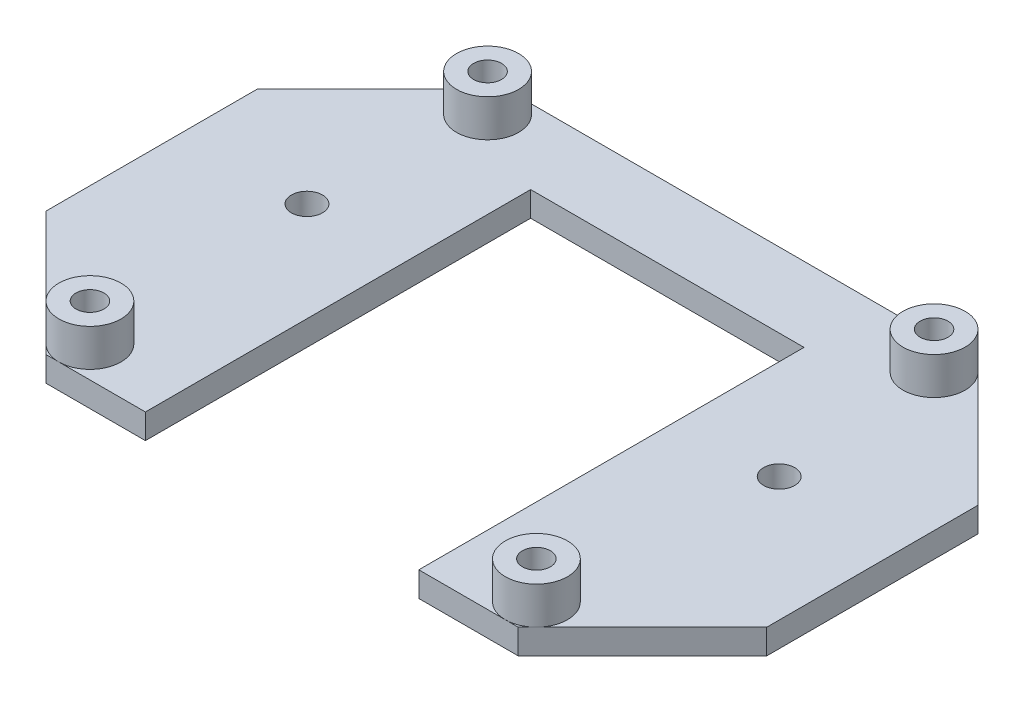
ISO-10303-21;
HEADER;
FILE_DESCRIPTION(('STEP AP214'),'2;1');
FILE_NAME('part.step','',(''),(''),'','','');
FILE_SCHEMA(('AUTOMOTIVE_DESIGN { 1 0 10303 214 1 1 1 1 }'));
ENDSEC;
DATA;
#1=APPLICATION_CONTEXT('core data for automotive mechanical design processes');
#2=APPLICATION_PROTOCOL_DEFINITION('international standard','automotive_design',2000,#1);
#3=PRODUCT_CONTEXT('',#1,'mechanical');
#4=PRODUCT('Part','Part','',(#3));
#5=PRODUCT_RELATED_PRODUCT_CATEGORY('part','',(#4));
#6=PRODUCT_DEFINITION_FORMATION('','',#4);
#7=PRODUCT_DEFINITION_CONTEXT('part definition',#1,'design');
#8=PRODUCT_DEFINITION('design','',#6,#7);
#9=PRODUCT_DEFINITION_SHAPE('','',#8);
#10=(LENGTH_UNIT() NAMED_UNIT(*) SI_UNIT(.MILLI.,.METRE.));
#11=(NAMED_UNIT(*) PLANE_ANGLE_UNIT() SI_UNIT($,.RADIAN.));
#12=(NAMED_UNIT(*) SI_UNIT($,.STERADIAN.) SOLID_ANGLE_UNIT());
#13=UNCERTAINTY_MEASURE_WITH_UNIT(LENGTH_MEASURE(1.E-05),#10,'distance_accuracy_value','');
#14=(GEOMETRIC_REPRESENTATION_CONTEXT(3) GLOBAL_UNCERTAINTY_ASSIGNED_CONTEXT((#13)) GLOBAL_UNIT_ASSIGNED_CONTEXT((#10,
#11,#12)) REPRESENTATION_CONTEXT('',''));
#15=CARTESIAN_POINT('',(0.,0.,0.));
#16=DIRECTION('',(0.,0.,1.));
#17=DIRECTION('',(1.,0.,0.));
#18=AXIS2_PLACEMENT_3D('',#15,#16,#17);
#19=CARTESIAN_POINT('',(0.,4.,0.));
#20=DIRECTION('',(0.,-1.,0.));
#21=DIRECTION('',(0.,0.,-1.));
#22=AXIS2_PLACEMENT_3D('',#19,#20,#21);
#23=PLANE('',#22);
#24=CARTESIAN_POINT('',(-35.9289321881345,4.,39.));
#25=DIRECTION('',(0.,1.,0.));
#26=DIRECTION('',(0.,0.,1.));
#27=AXIS2_PLACEMENT_3D('',#24,#25,#26);
#28=CIRCLE('',#27,5.);
#29=CARTESIAN_POINT('',(-39.4644660940672,4.,42.5355339059327));
#30=VERTEX_POINT('',#29);
#31=CARTESIAN_POINT('',(-35.9289321881345,4.,44.));
#32=VERTEX_POINT('',#31);
#33=EDGE_CURVE('E172',#30,#32,#28,.T.);
#34=ORIENTED_EDGE('',*,*,#33,.F.);
#35=DIRECTION('',(0.707106781186548,0.,0.707106781186547));
#36=VECTOR('',#35,1.);
#37=CARTESIAN_POINT('',(-38.,4.,44.));
#38=LINE('',#37,#36);
#39=CARTESIAN_POINT('',(-38.,4.,44.));
#40=VERTEX_POINT('',#39);
#41=EDGE_CURVE('E161',#30,#40,#38,.T.);
#42=ORIENTED_EDGE('',*,*,#41,.T.);
#43=DIRECTION('',(-1.,0.,0.));
#44=VECTOR('',#43,1.);
#45=CARTESIAN_POINT('',(-22.,4.,44.));
#46=LINE('',#45,#44);
#47=EDGE_CURVE('E173',#32,#40,#46,.T.);
#48=ORIENTED_EDGE('',*,*,#47,.F.);
#49=EDGE_LOOP('',(#34,#42,#48));
#50=FACE_BOUND('',#49,.T.);
#51=ADVANCED_FACE('F36',(#50),#23,.F.);
#52=CARTESIAN_POINT('',(35.9289321881345,4.,39.));
#53=DIRECTION('',(0.,1.,0.));
#54=DIRECTION('',(0.,0.,1.));
#55=AXIS2_PLACEMENT_3D('',#52,#53,#54);
#56=CIRCLE('',#55,5.);
#57=CARTESIAN_POINT('',(35.9289321881345,4.,44.));
#58=VERTEX_POINT('',#57);
#59=CARTESIAN_POINT('',(39.4644660940673,4.,42.5355339059328));
#60=VERTEX_POINT('',#59);
#61=EDGE_CURVE('E188',#58,#60,#56,.T.);
#62=ORIENTED_EDGE('',*,*,#61,.F.);
#63=DIRECTION('',(-1.,0.,0.));
#64=VECTOR('',#63,1.);
#65=CARTESIAN_POINT('',(58.,4.,44.));
#66=LINE('',#65,#64);
#67=CARTESIAN_POINT('',(38.,4.,44.));
#68=VERTEX_POINT('',#67);
#69=EDGE_CURVE('E209',#68,#58,#66,.T.);
#70=ORIENTED_EDGE('',*,*,#69,.F.);
#71=DIRECTION('',(0.707106781186547,0.,-0.707106781186548));
#72=VECTOR('',#71,1.);
#73=CARTESIAN_POINT('',(38.,4.,44.));
#74=LINE('',#73,#72);
#75=EDGE_CURVE('E170',#68,#60,#74,.T.);
#76=ORIENTED_EDGE('',*,*,#75,.T.);
#77=EDGE_LOOP('',(#62,#70,#76));
#78=FACE_BOUND('',#77,.T.);
#79=ADVANCED_FACE('F351',(#78),#23,.F.);
#80=EDGE_CURVE('E54',#32,#30,#28,.T.);
#81=ORIENTED_EDGE('',*,*,#80,.F.);
#82=CARTESIAN_POINT('',(-22.,4.,44.));
#83=VERTEX_POINT('',#82);
#84=EDGE_CURVE('E222',#83,#32,#46,.T.);
#85=ORIENTED_EDGE('',*,*,#84,.F.);
#86=DIRECTION('',(0.,0.,1.));
#87=VECTOR('',#86,1.);
#88=CARTESIAN_POINT('',(-22.,4.,24.));
#89=LINE('',#88,#87);
#90=CARTESIAN_POINT('',(-22.,4.,-18.));
#91=VERTEX_POINT('',#90);
#92=EDGE_CURVE('E224',#91,#83,#89,.T.);
#93=ORIENTED_EDGE('',*,*,#92,.F.);
#94=DIRECTION('',(-1.,0.,0.));
#95=VECTOR('',#94,1.);
#96=CARTESIAN_POINT('',(-22.,4.,-18.));
#97=LINE('',#96,#95);
#98=CARTESIAN_POINT('',(22.,4.,-18.));
#99=VERTEX_POINT('',#98);
#100=EDGE_CURVE('E225',#99,#91,#97,.T.);
#101=ORIENTED_EDGE('',*,*,#100,.F.);
#102=DIRECTION('',(0.,0.,-1.));
#103=VECTOR('',#102,1.);
#104=CARTESIAN_POINT('',(22.,4.,24.));
#105=LINE('',#104,#103);
#106=CARTESIAN_POINT('',(22.,4.,44.));
#107=VERTEX_POINT('',#106);
#108=EDGE_CURVE('E229',#107,#99,#105,.T.);
#109=ORIENTED_EDGE('',*,*,#108,.F.);
#110=EDGE_CURVE('E207',#58,#107,#66,.T.);
#111=ORIENTED_EDGE('',*,*,#110,.F.);
#112=EDGE_CURVE('E61',#60,#58,#56,.T.);
#113=ORIENTED_EDGE('',*,*,#112,.F.);
#114=CARTESIAN_POINT('',(58.,4.,24.));
#115=VERTEX_POINT('',#114);
#116=EDGE_CURVE('E288',#60,#115,#74,.T.);
#117=ORIENTED_EDGE('',*,*,#116,.T.);
#118=DIRECTION('',(0.,0.,-1.));
#119=VECTOR('',#118,1.);
#120=CARTESIAN_POINT('',(58.,4.,24.));
#121=LINE('',#120,#119);
#122=CARTESIAN_POINT('',(58.,4.,-9.99999999999994));
#123=VERTEX_POINT('',#122);
#124=EDGE_CURVE('E258',#115,#123,#121,.T.);
#125=ORIENTED_EDGE('',*,*,#124,.T.);
#126=DIRECTION('',(-0.707106781186546,0.,-0.707106781186549));
#127=VECTOR('',#126,1.);
#128=CARTESIAN_POINT('',(38.,4.,-30.));
#129=LINE('',#128,#127);
#130=CARTESIAN_POINT('',(39.4644660940672,4.,-28.5355339059328));
#131=VERTEX_POINT('',#130);
#132=EDGE_CURVE('E285',#123,#131,#129,.T.);
#133=ORIENTED_EDGE('',*,*,#132,.T.);
#134=CARTESIAN_POINT('',(35.9289321881345,4.,-25.));
#135=DIRECTION('',(0.,1.,0.));
#136=DIRECTION('',(0.,0.,1.));
#137=AXIS2_PLACEMENT_3D('',#134,#135,#136);
#138=CIRCLE('',#137,5.);
#139=CARTESIAN_POINT('',(35.9289321881345,4.,-30.));
#140=VERTEX_POINT('',#139);
#141=EDGE_CURVE('E187',#140,#131,#138,.T.);
#142=ORIENTED_EDGE('',*,*,#141,.F.);
#143=DIRECTION('',(1.,0.,0.));
#144=VECTOR('',#143,1.);
#145=CARTESIAN_POINT('',(-58.,4.,-30.));
#146=LINE('',#145,#144);
#147=CARTESIAN_POINT('',(-35.9289321881345,4.,-30.));
#148=VERTEX_POINT('',#147);
#149=EDGE_CURVE('E208',#148,#140,#146,.T.);
#150=ORIENTED_EDGE('',*,*,#149,.F.);
#151=CARTESIAN_POINT('',(-35.9289321881345,4.,-25.));
#152=DIRECTION('',(0.,1.,0.));
#153=DIRECTION('',(0.,0.,1.));
#154=AXIS2_PLACEMENT_3D('',#151,#152,#153);
#155=CIRCLE('',#154,5.);
#156=CARTESIAN_POINT('',(-39.4644660940673,4.,-28.5355339059327));
#157=VERTEX_POINT('',#156);
#158=EDGE_CURVE('E11',#157,#148,#155,.T.);
#159=ORIENTED_EDGE('',*,*,#158,.F.);
#160=DIRECTION('',(-0.707106781186547,0.,0.707106781186548));
#161=VECTOR('',#160,1.);
#162=CARTESIAN_POINT('',(-38.,4.,-30.));
#163=LINE('',#162,#161);
#164=CARTESIAN_POINT('',(-58.,4.,-9.99999999999993));
#165=VERTEX_POINT('',#164);
#166=EDGE_CURVE('E280',#157,#165,#163,.T.);
#167=ORIENTED_EDGE('',*,*,#166,.T.);
#168=DIRECTION('',(0.,0.,1.));
#169=VECTOR('',#168,1.);
#170=CARTESIAN_POINT('',(-58.,4.,24.));
#171=LINE('',#170,#169);
#172=CARTESIAN_POINT('',(-58.,4.,24.));
#173=VERTEX_POINT('',#172);
#174=EDGE_CURVE('E157',#165,#173,#171,.T.);
#175=ORIENTED_EDGE('',*,*,#174,.T.);
#176=EDGE_CURVE('E152',#173,#30,#38,.T.);
#177=ORIENTED_EDGE('',*,*,#176,.T.);
#178=EDGE_LOOP('',(#81,#85,#93,#101,#109,#111,#113,#117,#125,#133,#142,#150,#159,#167,#175,#177));
#179=FACE_BOUND('',#178,.T.);
#180=CARTESIAN_POINT('',(-38.,4.,2.00000000000001));
#181=DIRECTION('',(0.,1.,0.));
#182=DIRECTION('',(0.,0.,1.));
#183=AXIS2_PLACEMENT_3D('',#180,#181,#182);
#184=CIRCLE('',#183,2.5);
#185=CARTESIAN_POINT('',(-38.,4.,4.50000000000001));
#186=VERTEX_POINT('',#185);
#187=EDGE_CURVE('E246',#186,#186,#184,.T.);
#188=ORIENTED_EDGE('',*,*,#187,.F.);
#189=EDGE_LOOP('',(#188));
#190=FACE_BOUND('',#189,.T.);
#191=CARTESIAN_POINT('',(38.,4.,2.00000000000001));
#192=DIRECTION('',(0.,1.,0.));
#193=DIRECTION('',(0.,0.,1.));
#194=AXIS2_PLACEMENT_3D('',#191,#192,#193);
#195=CIRCLE('',#194,2.5);
#196=CARTESIAN_POINT('',(38.,4.,4.50000000000001));
#197=VERTEX_POINT('',#196);
#198=EDGE_CURVE('E236',#197,#197,#195,.T.);
#199=ORIENTED_EDGE('',*,*,#198,.F.);
#200=EDGE_LOOP('',(#199));
#201=FACE_BOUND('',#200,.T.);
#202=ADVANCED_FACE('F154',(#179,#190,#201),#23,.F.);
#203=EDGE_CURVE('E47',#148,#157,#155,.T.);
#204=ORIENTED_EDGE('',*,*,#203,.F.);
#205=CARTESIAN_POINT('',(-38.,4.,-30.));
#206=VERTEX_POINT('',#205);
#207=EDGE_CURVE('E205',#206,#148,#146,.T.);
#208=ORIENTED_EDGE('',*,*,#207,.F.);
#209=EDGE_CURVE('E281',#206,#157,#163,.T.);
#210=ORIENTED_EDGE('',*,*,#209,.T.);
#211=EDGE_LOOP('',(#204,#208,#210));
#212=FACE_BOUND('',#211,.T.);
#213=ADVANCED_FACE('F321',(#212),#23,.F.);
#214=CARTESIAN_POINT('',(58.,4.,24.));
#215=DIRECTION('',(-1.,0.,0.));
#216=DIRECTION('',(0.,0.,1.));
#217=AXIS2_PLACEMENT_3D('',#214,#215,#216);
#218=PLANE('',#217);
#219=ORIENTED_EDGE('',*,*,#124,.F.);
#220=DIRECTION('',(0.,-1.,0.));
#221=VECTOR('',#220,1.);
#222=CARTESIAN_POINT('',(58.,0.,24.));
#223=LINE('',#222,#221);
#224=CARTESIAN_POINT('',(58.,0.,24.));
#225=VERTEX_POINT('',#224);
#226=EDGE_CURVE('E295',#115,#225,#223,.T.);
#227=ORIENTED_EDGE('',*,*,#226,.T.);
#228=DIRECTION('',(0.,0.,-1.));
#229=VECTOR('',#228,1.);
#230=CARTESIAN_POINT('',(58.,0.,24.));
#231=LINE('',#230,#229);
#232=CARTESIAN_POINT('',(58.,0.,-9.99999999999994));
#233=VERTEX_POINT('',#232);
#234=EDGE_CURVE('E253',#225,#233,#231,.T.);
#235=ORIENTED_EDGE('',*,*,#234,.T.);
#236=DIRECTION('',(0.,1.,0.));
#237=VECTOR('',#236,1.);
#238=CARTESIAN_POINT('',(58.,4.,-9.99999999999994));
#239=LINE('',#238,#237);
#240=EDGE_CURVE('E293',#233,#123,#239,.T.);
#241=ORIENTED_EDGE('',*,*,#240,.T.);
#242=EDGE_LOOP('',(#219,#227,#235,#241));
#243=FACE_BOUND('',#242,.T.);
#244=ADVANCED_FACE('F367',(#243),#218,.F.);
#245=CARTESIAN_POINT('',(-58.,4.,24.));
#246=DIRECTION('',(1.,0.,0.));
#247=DIRECTION('',(0.,0.,-1.));
#248=AXIS2_PLACEMENT_3D('',#245,#246,#247);
#249=PLANE('',#248);
#250=DIRECTION('',(0.,0.,1.));
#251=VECTOR('',#250,1.);
#252=CARTESIAN_POINT('',(-58.,0.,24.));
#253=LINE('',#252,#251);
#254=CARTESIAN_POINT('',(-58.,0.,-9.99999999999993));
#255=VERTEX_POINT('',#254);
#256=CARTESIAN_POINT('',(-58.,0.,24.));
#257=VERTEX_POINT('',#256);
#258=EDGE_CURVE('E261',#255,#257,#253,.T.);
#259=ORIENTED_EDGE('',*,*,#258,.T.);
#260=DIRECTION('',(0.,1.,0.));
#261=VECTOR('',#260,1.);
#262=CARTESIAN_POINT('',(-58.,4.,24.));
#263=LINE('',#262,#261);
#264=EDGE_CURVE('E278',#257,#173,#263,.T.);
#265=ORIENTED_EDGE('',*,*,#264,.T.);
#266=ORIENTED_EDGE('',*,*,#174,.F.);
#267=DIRECTION('',(0.,-1.,0.));
#268=VECTOR('',#267,1.);
#269=CARTESIAN_POINT('',(-58.,0.,-9.99999999999993));
#270=LINE('',#269,#268);
#271=EDGE_CURVE('E276',#165,#255,#270,.T.);
#272=ORIENTED_EDGE('',*,*,#271,.T.);
#273=EDGE_LOOP('',(#259,#265,#266,#272));
#274=FACE_BOUND('',#273,.T.);
#275=ADVANCED_FACE('F360',(#274),#249,.F.);
#276=EDGE_CURVE('E194',#131,#140,#138,.T.);
#277=ORIENTED_EDGE('',*,*,#276,.F.);
#278=CARTESIAN_POINT('',(38.,4.,-30.));
#279=VERTEX_POINT('',#278);
#280=EDGE_CURVE('E284',#131,#279,#129,.T.);
#281=ORIENTED_EDGE('',*,*,#280,.T.);
#282=EDGE_CURVE('E204',#140,#279,#146,.T.);
#283=ORIENTED_EDGE('',*,*,#282,.F.);
#284=EDGE_LOOP('',(#277,#281,#283));
#285=FACE_BOUND('',#284,.T.);
#286=ADVANCED_FACE('F328',(#285),#23,.F.);
#287=CARTESIAN_POINT('',(0.,0.,0.));
#288=DIRECTION('',(0.,-1.,0.));
#289=DIRECTION('',(0.,0.,-1.));
#290=AXIS2_PLACEMENT_3D('',#287,#288,#289);
#291=PLANE('',#290);
#292=CARTESIAN_POINT('',(-35.9289321881345,0.,39.));
#293=DIRECTION('',(0.,-1.,0.));
#294=DIRECTION('',(0.,0.,-1.));
#295=AXIS2_PLACEMENT_3D('',#292,#293,#294);
#296=CIRCLE('',#295,2.25);
#297=CARTESIAN_POINT('',(-35.9289321881345,0.,36.75));
#298=VERTEX_POINT('',#297);
#299=EDGE_CURVE('E732',#298,#298,#296,.F.);
#300=ORIENTED_EDGE('',*,*,#299,.T.);
#301=EDGE_LOOP('',(#300));
#302=FACE_BOUND('',#301,.T.);
#303=CARTESIAN_POINT('',(35.9289321881345,0.,39.));
#304=DIRECTION('',(0.,-1.,0.));
#305=DIRECTION('',(0.,0.,-1.));
#306=AXIS2_PLACEMENT_3D('',#303,#304,#305);
#307=CIRCLE('',#306,2.25);
#308=CARTESIAN_POINT('',(35.9289321881345,0.,36.75));
#309=VERTEX_POINT('',#308);
#310=EDGE_CURVE('E739',#309,#309,#307,.F.);
#311=ORIENTED_EDGE('',*,*,#310,.T.);
#312=EDGE_LOOP('',(#311));
#313=FACE_BOUND('',#312,.T.);
#314=CARTESIAN_POINT('',(35.9289321881345,0.,-25.));
#315=DIRECTION('',(0.,-1.,0.));
#316=DIRECTION('',(0.,0.,-1.));
#317=AXIS2_PLACEMENT_3D('',#314,#315,#316);
#318=CIRCLE('',#317,2.25);
#319=CARTESIAN_POINT('',(35.9289321881345,0.,-27.25));
#320=VERTEX_POINT('',#319);
#321=EDGE_CURVE('E729',#320,#320,#318,.F.);
#322=ORIENTED_EDGE('',*,*,#321,.T.);
#323=EDGE_LOOP('',(#322));
#324=FACE_BOUND('',#323,.T.);
#325=CARTESIAN_POINT('',(-35.9289321881345,0.,-25.));
#326=DIRECTION('',(0.,-1.,0.));
#327=DIRECTION('',(0.,0.,-1.));
#328=AXIS2_PLACEMENT_3D('',#325,#326,#327);
#329=CIRCLE('',#328,2.25);
#330=CARTESIAN_POINT('',(-35.9289321881345,0.,-27.25));
#331=VERTEX_POINT('',#330);
#332=EDGE_CURVE('E176',#331,#331,#329,.F.);
#333=ORIENTED_EDGE('',*,*,#332,.T.);
#334=EDGE_LOOP('',(#333));
#335=FACE_BOUND('',#334,.T.);
#336=DIRECTION('',(1.,0.,0.));
#337=VECTOR('',#336,1.);
#338=CARTESIAN_POINT('',(-58.,0.,44.));
#339=LINE('',#338,#337);
#340=CARTESIAN_POINT('',(-38.,0.,44.));
#341=VERTEX_POINT('',#340);
#342=CARTESIAN_POINT('',(-22.,0.,44.));
#343=VERTEX_POINT('',#342);
#344=EDGE_CURVE('E217',#341,#343,#339,.T.);
#345=ORIENTED_EDGE('',*,*,#344,.F.);
#346=DIRECTION('',(-0.707106781186548,0.,-0.707106781186547));
#347=VECTOR('',#346,1.);
#348=CARTESIAN_POINT('',(-41.,0.,41.));
#349=LINE('',#348,#347);
#350=EDGE_CURVE('E274',#341,#257,#349,.T.);
#351=ORIENTED_EDGE('',*,*,#350,.T.);
#352=ORIENTED_EDGE('',*,*,#258,.F.);
#353=DIRECTION('',(0.707106781186547,0.,-0.707106781186548));
#354=VECTOR('',#353,1.);
#355=CARTESIAN_POINT('',(-34.,0.,-34.));
#356=LINE('',#355,#354);
#357=CARTESIAN_POINT('',(-38.,0.,-30.));
#358=VERTEX_POINT('',#357);
#359=EDGE_CURVE('E268',#255,#358,#356,.T.);
#360=ORIENTED_EDGE('',*,*,#359,.T.);
#361=DIRECTION('',(-1.,0.,0.));
#362=VECTOR('',#361,1.);
#363=CARTESIAN_POINT('',(58.,0.,-30.));
#364=LINE('',#363,#362);
#365=CARTESIAN_POINT('',(38.,0.,-30.));
#366=VERTEX_POINT('',#365);
#367=EDGE_CURVE('E199',#366,#358,#364,.T.);
#368=ORIENTED_EDGE('',*,*,#367,.F.);
#369=DIRECTION('',(0.707106781186546,0.,0.707106781186549));
#370=VECTOR('',#369,1.);
#371=CARTESIAN_POINT('',(34.0000000000001,0.,-34.));
#372=LINE('',#371,#370);
#373=EDGE_CURVE('E270',#366,#233,#372,.T.);
#374=ORIENTED_EDGE('',*,*,#373,.T.);
#375=ORIENTED_EDGE('',*,*,#234,.F.);
#376=DIRECTION('',(-0.707106781186547,0.,0.707106781186548));
#377=VECTOR('',#376,1.);
#378=CARTESIAN_POINT('',(41.,0.,41.));
#379=LINE('',#378,#377);
#380=CARTESIAN_POINT('',(38.,0.,44.));
#381=VERTEX_POINT('',#380);
#382=EDGE_CURVE('E272',#225,#381,#379,.T.);
#383=ORIENTED_EDGE('',*,*,#382,.T.);
#384=DIRECTION('',(1.,0.,0.));
#385=VECTOR('',#384,1.);
#386=CARTESIAN_POINT('',(22.,0.,44.));
#387=LINE('',#386,#385);
#388=CARTESIAN_POINT('',(22.,0.,44.));
#389=VERTEX_POINT('',#388);
#390=EDGE_CURVE('E214',#389,#381,#387,.T.);
#391=ORIENTED_EDGE('',*,*,#390,.F.);
#392=DIRECTION('',(0.,0.,-1.));
#393=VECTOR('',#392,1.);
#394=CARTESIAN_POINT('',(22.,0.,24.));
#395=LINE('',#394,#393);
#396=CARTESIAN_POINT('',(22.,0.,-18.));
#397=VERTEX_POINT('',#396);
#398=EDGE_CURVE('E228',#389,#397,#395,.T.);
#399=ORIENTED_EDGE('',*,*,#398,.T.);
#400=DIRECTION('',(-1.,0.,0.));
#401=VECTOR('',#400,1.);
#402=CARTESIAN_POINT('',(-22.,0.,-18.));
#403=LINE('',#402,#401);
#404=CARTESIAN_POINT('',(-22.,0.,-18.));
#405=VERTEX_POINT('',#404);
#406=EDGE_CURVE('E238',#397,#405,#403,.T.);
#407=ORIENTED_EDGE('',*,*,#406,.T.);
#408=DIRECTION('',(0.,0.,1.));
#409=VECTOR('',#408,1.);
#410=CARTESIAN_POINT('',(-22.,0.,24.));
#411=LINE('',#410,#409);
#412=EDGE_CURVE('E233',#405,#343,#411,.T.);
#413=ORIENTED_EDGE('',*,*,#412,.T.);
#414=EDGE_LOOP('',(#345,#351,#352,#360,#368,#374,#375,#383,#391,#399,#407,#413));
#415=FACE_BOUND('',#414,.T.);
#416=CARTESIAN_POINT('',(-38.,0.,2.00000000000001));
#417=DIRECTION('',(0.,-1.,0.));
#418=DIRECTION('',(0.,0.,-1.));
#419=AXIS2_PLACEMENT_3D('',#416,#417,#418);
#420=CIRCLE('',#419,2.5);
#421=CARTESIAN_POINT('',(-38.,0.,-0.499999999999997));
#422=VERTEX_POINT('',#421);
#423=EDGE_CURVE('E249',#422,#422,#420,.F.);
#424=ORIENTED_EDGE('',*,*,#423,.T.);
#425=EDGE_LOOP('',(#424));
#426=FACE_BOUND('',#425,.T.);
#427=CARTESIAN_POINT('',(38.,0.,2.00000000000001));
#428=DIRECTION('',(0.,-1.,0.));
#429=DIRECTION('',(0.,0.,-1.));
#430=AXIS2_PLACEMENT_3D('',#427,#428,#429);
#431=CIRCLE('',#430,2.5);
#432=CARTESIAN_POINT('',(38.,0.,-0.499999999999997));
#433=VERTEX_POINT('',#432);
#434=EDGE_CURVE('E250',#433,#433,#431,.F.);
#435=ORIENTED_EDGE('',*,*,#434,.T.);
#436=EDGE_LOOP('',(#435));
#437=FACE_BOUND('',#436,.T.);
#438=ADVANCED_FACE('F311',(#302,#313,#324,#335,#415,#426,#437),#291,.T.);
#439=CARTESIAN_POINT('',(38.,-7.07106781186548,2.00000000000001));
#440=DIRECTION('',(0.,1.,0.));
#441=DIRECTION('',(0.,0.,1.));
#442=AXIS2_PLACEMENT_3D('',#439,#440,#441);
#443=CYLINDRICAL_SURFACE('',#442,2.5);
#444=ORIENTED_EDGE('',*,*,#198,.T.);
#445=EDGE_LOOP('',(#444));
#446=FACE_BOUND('',#445,.T.);
#447=ORIENTED_EDGE('',*,*,#434,.F.);
#448=EDGE_LOOP('',(#447));
#449=FACE_BOUND('',#448,.T.);
#450=ADVANCED_FACE('F365',(#446,#449),#443,.F.);
#451=CARTESIAN_POINT('',(-38.,-7.07106781186548,2.00000000000001));
#452=DIRECTION('',(0.,1.,0.));
#453=DIRECTION('',(0.,0.,1.));
#454=AXIS2_PLACEMENT_3D('',#451,#452,#453);
#455=CYLINDRICAL_SURFACE('',#454,2.5);
#456=ORIENTED_EDGE('',*,*,#187,.T.);
#457=EDGE_LOOP('',(#456));
#458=FACE_BOUND('',#457,.T.);
#459=ORIENTED_EDGE('',*,*,#423,.F.);
#460=EDGE_LOOP('',(#459));
#461=FACE_BOUND('',#460,.T.);
#462=ADVANCED_FACE('F433',(#458,#461),#455,.F.);
#463=CARTESIAN_POINT('',(22.,-60.8276253029822,24.));
#464=DIRECTION('',(1.,0.,0.));
#465=DIRECTION('',(0.,0.,-1.));
#466=AXIS2_PLACEMENT_3D('',#463,#464,#465);
#467=PLANE('',#466);
#468=ORIENTED_EDGE('',*,*,#398,.F.);
#469=DIRECTION('',(0.,-1.,0.));
#470=VECTOR('',#469,1.);
#471=CARTESIAN_POINT('',(22.,4.,44.));
#472=LINE('',#471,#470);
#473=EDGE_CURVE('E211',#107,#389,#472,.T.);
#474=ORIENTED_EDGE('',*,*,#473,.F.);
#475=ORIENTED_EDGE('',*,*,#108,.T.);
#476=DIRECTION('',(0.,1.,0.));
#477=VECTOR('',#476,1.);
#478=CARTESIAN_POINT('',(22.,-60.8276253029822,-18.));
#479=LINE('',#478,#477);
#480=EDGE_CURVE('E241',#397,#99,#479,.T.);
#481=ORIENTED_EDGE('',*,*,#480,.F.);
#482=EDGE_LOOP('',(#468,#474,#475,#481));
#483=FACE_BOUND('',#482,.T.);
#484=ADVANCED_FACE('F429',(#483),#467,.F.);
#485=CARTESIAN_POINT('',(-22.,-60.8276253029822,-18.));
#486=DIRECTION('',(0.,0.,-1.));
#487=DIRECTION('',(-1.,0.,0.));
#488=AXIS2_PLACEMENT_3D('',#485,#486,#487);
#489=PLANE('',#488);
#490=ORIENTED_EDGE('',*,*,#480,.T.);
#491=ORIENTED_EDGE('',*,*,#100,.T.);
#492=DIRECTION('',(0.,1.,0.));
#493=VECTOR('',#492,1.);
#494=CARTESIAN_POINT('',(-22.,-60.8276253029822,-18.));
#495=LINE('',#494,#493);
#496=EDGE_CURVE('E237',#405,#91,#495,.T.);
#497=ORIENTED_EDGE('',*,*,#496,.F.);
#498=ORIENTED_EDGE('',*,*,#406,.F.);
#499=EDGE_LOOP('',(#490,#491,#497,#498));
#500=FACE_BOUND('',#499,.T.);
#501=ADVANCED_FACE('F418',(#500),#489,.F.);
#502=CARTESIAN_POINT('',(-22.,-60.8276253029822,24.));
#503=DIRECTION('',(-1.,0.,0.));
#504=DIRECTION('',(0.,0.,1.));
#505=AXIS2_PLACEMENT_3D('',#502,#503,#504);
#506=PLANE('',#505);
#507=ORIENTED_EDGE('',*,*,#496,.T.);
#508=ORIENTED_EDGE('',*,*,#92,.T.);
#509=DIRECTION('',(0.,1.,0.));
#510=VECTOR('',#509,1.);
#511=CARTESIAN_POINT('',(-22.,0.,44.));
#512=LINE('',#511,#510);
#513=EDGE_CURVE('E219',#343,#83,#512,.T.);
#514=ORIENTED_EDGE('',*,*,#513,.F.);
#515=ORIENTED_EDGE('',*,*,#412,.F.);
#516=EDGE_LOOP('',(#507,#508,#514,#515));
#517=FACE_BOUND('',#516,.T.);
#518=ADVANCED_FACE('F412',(#517),#506,.F.);
#519=CARTESIAN_POINT('',(0.,0.,44.));
#520=DIRECTION('',(0.,0.,1.));
#521=DIRECTION('',(1.,0.,0.));
#522=AXIS2_PLACEMENT_3D('',#519,#520,#521);
#523=PLANE('',#522);
#524=ORIENTED_EDGE('',*,*,#84,.T.);
#525=ORIENTED_EDGE('',*,*,#47,.T.);
#526=DIRECTION('',(0.,-1.,0.));
#527=VECTOR('',#526,1.);
#528=CARTESIAN_POINT('',(-38.,0.,44.));
#529=LINE('',#528,#527);
#530=EDGE_CURVE('E168',#40,#341,#529,.T.);
#531=ORIENTED_EDGE('',*,*,#530,.T.);
#532=ORIENTED_EDGE('',*,*,#344,.T.);
#533=ORIENTED_EDGE('',*,*,#513,.T.);
#534=EDGE_LOOP('',(#524,#525,#531,#532,#533));
#535=FACE_BOUND('',#534,.T.);
#536=ADVANCED_FACE('F417',(#535),#523,.T.);
#537=CARTESIAN_POINT('',(0.,0.,44.));
#538=DIRECTION('',(0.,0.,1.));
#539=DIRECTION('',(1.,0.,0.));
#540=AXIS2_PLACEMENT_3D('',#537,#538,#539);
#541=PLANE('',#540);
#542=ORIENTED_EDGE('',*,*,#390,.T.);
#543=DIRECTION('',(0.,1.,0.));
#544=VECTOR('',#543,1.);
#545=CARTESIAN_POINT('',(38.,4.,44.));
#546=LINE('',#545,#544);
#547=EDGE_CURVE('E160',#381,#68,#546,.T.);
#548=ORIENTED_EDGE('',*,*,#547,.T.);
#549=ORIENTED_EDGE('',*,*,#69,.T.);
#550=ORIENTED_EDGE('',*,*,#110,.T.);
#551=ORIENTED_EDGE('',*,*,#473,.T.);
#552=EDGE_LOOP('',(#542,#548,#549,#550,#551));
#553=FACE_BOUND('',#552,.T.);
#554=ADVANCED_FACE('F571',(#553),#541,.T.);
#555=CARTESIAN_POINT('',(0.,0.,-30.));
#556=DIRECTION('',(0.,0.,-1.));
#557=DIRECTION('',(-1.,0.,0.));
#558=AXIS2_PLACEMENT_3D('',#555,#556,#557);
#559=PLANE('',#558);
#560=ORIENTED_EDGE('',*,*,#207,.T.);
#561=ORIENTED_EDGE('',*,*,#149,.T.);
#562=ORIENTED_EDGE('',*,*,#282,.T.);
#563=DIRECTION('',(0.,-1.,0.));
#564=VECTOR('',#563,1.);
#565=CARTESIAN_POINT('',(38.,0.,-30.));
#566=LINE('',#565,#564);
#567=EDGE_CURVE('E41',#279,#366,#566,.T.);
#568=ORIENTED_EDGE('',*,*,#567,.T.);
#569=ORIENTED_EDGE('',*,*,#367,.T.);
#570=DIRECTION('',(0.,1.,0.));
#571=VECTOR('',#570,1.);
#572=CARTESIAN_POINT('',(-38.,4.,-30.));
#573=LINE('',#572,#571);
#574=EDGE_CURVE('E296',#358,#206,#573,.T.);
#575=ORIENTED_EDGE('',*,*,#574,.T.);
#576=EDGE_LOOP('',(#560,#561,#562,#568,#569,#575));
#577=FACE_BOUND('',#576,.T.);
#578=ADVANCED_FACE('F304',(#577),#559,.T.);
#579=CARTESIAN_POINT('',(-38.,0.,44.));
#580=DIRECTION('',(-0.707106781186547,0.,0.707106781186548));
#581=DIRECTION('',(0.,1.,0.));
#582=AXIS2_PLACEMENT_3D('',#579,#580,#581);
#583=PLANE('',#582);
#584=ORIENTED_EDGE('',*,*,#176,.F.);
#585=ORIENTED_EDGE('',*,*,#264,.F.);
#586=ORIENTED_EDGE('',*,*,#350,.F.);
#587=ORIENTED_EDGE('',*,*,#530,.F.);
#588=ORIENTED_EDGE('',*,*,#41,.F.);
#589=EDGE_LOOP('',(#584,#585,#586,#587,#588));
#590=FACE_BOUND('',#589,.T.);
#591=ADVANCED_FACE('F166',(#590),#583,.T.);
#592=CARTESIAN_POINT('',(38.,0.,44.));
#593=DIRECTION('',(0.707106781186548,0.,0.707106781186547));
#594=DIRECTION('',(0.,-1.,0.));
#595=AXIS2_PLACEMENT_3D('',#592,#593,#594);
#596=PLANE('',#595);
#597=ORIENTED_EDGE('',*,*,#382,.F.);
#598=ORIENTED_EDGE('',*,*,#226,.F.);
#599=ORIENTED_EDGE('',*,*,#116,.F.);
#600=ORIENTED_EDGE('',*,*,#75,.F.);
#601=ORIENTED_EDGE('',*,*,#547,.F.);
#602=EDGE_LOOP('',(#597,#598,#599,#600,#601));
#603=FACE_BOUND('',#602,.T.);
#604=ADVANCED_FACE('F568',(#603),#596,.T.);
#605=CARTESIAN_POINT('',(38.,0.,-30.));
#606=DIRECTION('',(0.707106781186549,0.,-0.707106781186546));
#607=DIRECTION('',(0.,1.,0.));
#608=AXIS2_PLACEMENT_3D('',#605,#606,#607);
#609=PLANE('',#608);
#610=ORIENTED_EDGE('',*,*,#132,.F.);
#611=ORIENTED_EDGE('',*,*,#240,.F.);
#612=ORIENTED_EDGE('',*,*,#373,.F.);
#613=ORIENTED_EDGE('',*,*,#567,.F.);
#614=ORIENTED_EDGE('',*,*,#280,.F.);
#615=EDGE_LOOP('',(#610,#611,#612,#613,#614));
#616=FACE_BOUND('',#615,.T.);
#617=ADVANCED_FACE('F330',(#616),#609,.T.);
#618=CARTESIAN_POINT('',(-38.,0.,-30.));
#619=DIRECTION('',(-0.707106781186548,0.,-0.707106781186547));
#620=DIRECTION('',(0.,-1.,0.));
#621=AXIS2_PLACEMENT_3D('',#618,#619,#620);
#622=PLANE('',#621);
#623=ORIENTED_EDGE('',*,*,#359,.F.);
#624=ORIENTED_EDGE('',*,*,#271,.F.);
#625=ORIENTED_EDGE('',*,*,#166,.F.);
#626=ORIENTED_EDGE('',*,*,#209,.F.);
#627=ORIENTED_EDGE('',*,*,#574,.F.);
#628=EDGE_LOOP('',(#623,#624,#625,#626,#627));
#629=FACE_BOUND('',#628,.T.);
#630=ADVANCED_FACE('F39',(#629),#622,.T.);
#631=CARTESIAN_POINT('',(-35.9289321881345,10.,-25.));
#632=DIRECTION('',(0.,-1.,0.));
#633=DIRECTION('',(0.,0.,-1.));
#634=AXIS2_PLACEMENT_3D('',#631,#632,#633);
#635=CYLINDRICAL_SURFACE('',#634,5.);
#636=CARTESIAN_POINT('',(-35.9289321881345,10.,-25.));
#637=DIRECTION('',(0.,1.,0.));
#638=DIRECTION('',(0.,0.,1.));
#639=AXIS2_PLACEMENT_3D('',#636,#637,#638);
#640=CIRCLE('',#639,5.);
#641=CARTESIAN_POINT('',(-35.9289321881345,10.,-20.));
#642=VERTEX_POINT('',#641);
#643=EDGE_CURVE('E197',#642,#642,#640,.T.);
#644=ORIENTED_EDGE('',*,*,#643,.F.);
#645=EDGE_LOOP('',(#644));
#646=FACE_BOUND('',#645,.T.);
#647=ORIENTED_EDGE('',*,*,#203,.T.);
#648=ORIENTED_EDGE('',*,*,#158,.T.);
#649=EDGE_LOOP('',(#647,#648));
#650=FACE_BOUND('',#649,.T.);
#651=ADVANCED_FACE('F323',(#646,#650),#635,.T.);
#652=CARTESIAN_POINT('',(-35.9289321881345,10.,-25.));
#653=DIRECTION('',(0.,1.,0.));
#654=DIRECTION('',(0.,0.,1.));
#655=AXIS2_PLACEMENT_3D('',#652,#653,#654);
#656=PLANE('',#655);
#657=CARTESIAN_POINT('',(-35.9289321881345,10.,-25.));
#658=DIRECTION('',(0.,1.,0.));
#659=DIRECTION('',(0.,0.,1.));
#660=AXIS2_PLACEMENT_3D('',#657,#658,#659);
#661=CIRCLE('',#660,2.25);
#662=CARTESIAN_POINT('',(-35.9289321881345,10.,-22.75));
#663=VERTEX_POINT('',#662);
#664=EDGE_CURVE('E725',#663,#663,#661,.T.);
#665=ORIENTED_EDGE('',*,*,#664,.F.);
#666=EDGE_LOOP('',(#665));
#667=FACE_BOUND('',#666,.T.);
#668=ORIENTED_EDGE('',*,*,#643,.T.);
#669=EDGE_LOOP('',(#668));
#670=FACE_BOUND('',#669,.T.);
#671=ADVANCED_FACE('F337',(#667,#670),#656,.T.);
#672=CARTESIAN_POINT('',(35.9289321881345,10.,-25.));
#673=DIRECTION('',(0.,-1.,0.));
#674=DIRECTION('',(0.,0.,-1.));
#675=AXIS2_PLACEMENT_3D('',#672,#673,#674);
#676=CYLINDRICAL_SURFACE('',#675,5.);
#677=CARTESIAN_POINT('',(35.9289321881345,10.,-25.));
#678=DIRECTION('',(0.,1.,0.));
#679=DIRECTION('',(0.,0.,1.));
#680=AXIS2_PLACEMENT_3D('',#677,#678,#679);
#681=CIRCLE('',#680,5.);
#682=CARTESIAN_POINT('',(35.9289321881345,10.,-20.));
#683=VERTEX_POINT('',#682);
#684=EDGE_CURVE('E191',#683,#683,#681,.T.);
#685=ORIENTED_EDGE('',*,*,#684,.F.);
#686=EDGE_LOOP('',(#685));
#687=FACE_BOUND('',#686,.T.);
#688=ORIENTED_EDGE('',*,*,#276,.T.);
#689=ORIENTED_EDGE('',*,*,#141,.T.);
#690=EDGE_LOOP('',(#688,#689));
#691=FACE_BOUND('',#690,.T.);
#692=ADVANCED_FACE('F334',(#687,#691),#676,.T.);
#693=CARTESIAN_POINT('',(35.9289321881345,10.,-25.));
#694=DIRECTION('',(0.,1.,0.));
#695=DIRECTION('',(0.,0.,1.));
#696=AXIS2_PLACEMENT_3D('',#693,#694,#695);
#697=PLANE('',#696);
#698=CARTESIAN_POINT('',(35.9289321881345,10.,-25.));
#699=DIRECTION('',(0.,1.,0.));
#700=DIRECTION('',(0.,0.,1.));
#701=AXIS2_PLACEMENT_3D('',#698,#699,#700);
#702=CIRCLE('',#701,2.25);
#703=CARTESIAN_POINT('',(35.9289321881345,10.,-22.75));
#704=VERTEX_POINT('',#703);
#705=EDGE_CURVE('E742',#704,#704,#702,.T.);
#706=ORIENTED_EDGE('',*,*,#705,.F.);
#707=EDGE_LOOP('',(#706));
#708=FACE_BOUND('',#707,.T.);
#709=ORIENTED_EDGE('',*,*,#684,.T.);
#710=EDGE_LOOP('',(#709));
#711=FACE_BOUND('',#710,.T.);
#712=ADVANCED_FACE('F336',(#708,#711),#697,.T.);
#713=CARTESIAN_POINT('',(35.9289321881345,10.,39.));
#714=DIRECTION('',(0.,-1.,0.));
#715=DIRECTION('',(0.,0.,-1.));
#716=AXIS2_PLACEMENT_3D('',#713,#714,#715);
#717=CYLINDRICAL_SURFACE('',#716,5.);
#718=CARTESIAN_POINT('',(35.9289321881345,10.,39.));
#719=DIRECTION('',(0.,1.,0.));
#720=DIRECTION('',(0.,0.,1.));
#721=AXIS2_PLACEMENT_3D('',#718,#719,#720);
#722=CIRCLE('',#721,5.);
#723=CARTESIAN_POINT('',(35.9289321881345,10.,44.));
#724=VERTEX_POINT('',#723);
#725=EDGE_CURVE('E184',#724,#724,#722,.T.);
#726=ORIENTED_EDGE('',*,*,#725,.F.);
#727=EDGE_LOOP('',(#726));
#728=FACE_BOUND('',#727,.T.);
#729=ORIENTED_EDGE('',*,*,#61,.T.);
#730=ORIENTED_EDGE('',*,*,#112,.T.);
#731=EDGE_LOOP('',(#729,#730));
#732=FACE_BOUND('',#731,.T.);
#733=ADVANCED_FACE('F344',(#728,#732),#717,.T.);
#734=CARTESIAN_POINT('',(35.9289321881345,10.,39.));
#735=DIRECTION('',(0.,1.,0.));
#736=DIRECTION('',(0.,0.,1.));
#737=AXIS2_PLACEMENT_3D('',#734,#735,#736);
#738=PLANE('',#737);
#739=CARTESIAN_POINT('',(35.9289321881345,10.,39.));
#740=DIRECTION('',(0.,1.,0.));
#741=DIRECTION('',(0.,0.,1.));
#742=AXIS2_PLACEMENT_3D('',#739,#740,#741);
#743=CIRCLE('',#742,2.25);
#744=CARTESIAN_POINT('',(35.9289321881345,10.,41.25));
#745=VERTEX_POINT('',#744);
#746=EDGE_CURVE('E735',#745,#745,#743,.T.);
#747=ORIENTED_EDGE('',*,*,#746,.F.);
#748=EDGE_LOOP('',(#747));
#749=FACE_BOUND('',#748,.T.);
#750=ORIENTED_EDGE('',*,*,#725,.T.);
#751=EDGE_LOOP('',(#750));
#752=FACE_BOUND('',#751,.T.);
#753=ADVANCED_FACE('F495',(#749,#752),#738,.T.);
#754=CARTESIAN_POINT('',(-35.9289321881345,10.,39.));
#755=DIRECTION('',(0.,-1.,0.));
#756=DIRECTION('',(0.,0.,-1.));
#757=AXIS2_PLACEMENT_3D('',#754,#755,#756);
#758=CYLINDRICAL_SURFACE('',#757,5.);
#759=CARTESIAN_POINT('',(-35.9289321881345,10.,39.));
#760=DIRECTION('',(0.,1.,0.));
#761=DIRECTION('',(0.,0.,1.));
#762=AXIS2_PLACEMENT_3D('',#759,#760,#761);
#763=CIRCLE('',#762,5.);
#764=CARTESIAN_POINT('',(-35.9289321881345,10.,44.));
#765=VERTEX_POINT('',#764);
#766=EDGE_CURVE('E179',#765,#765,#763,.T.);
#767=ORIENTED_EDGE('',*,*,#766,.F.);
#768=EDGE_LOOP('',(#767));
#769=FACE_BOUND('',#768,.T.);
#770=ORIENTED_EDGE('',*,*,#80,.T.);
#771=ORIENTED_EDGE('',*,*,#33,.T.);
#772=EDGE_LOOP('',(#770,#771));
#773=FACE_BOUND('',#772,.T.);
#774=ADVANCED_FACE('F178',(#769,#773),#758,.T.);
#775=CARTESIAN_POINT('',(-35.9289321881345,10.,39.));
#776=DIRECTION('',(0.,1.,0.));
#777=DIRECTION('',(0.,0.,1.));
#778=AXIS2_PLACEMENT_3D('',#775,#776,#777);
#779=PLANE('',#778);
#780=CARTESIAN_POINT('',(-35.9289321881345,10.,39.));
#781=DIRECTION('',(0.,1.,0.));
#782=DIRECTION('',(0.,0.,1.));
#783=AXIS2_PLACEMENT_3D('',#780,#781,#782);
#784=CIRCLE('',#783,2.25);
#785=CARTESIAN_POINT('',(-35.9289321881345,10.,41.25));
#786=VERTEX_POINT('',#785);
#787=EDGE_CURVE('E736',#786,#786,#784,.T.);
#788=ORIENTED_EDGE('',*,*,#787,.F.);
#789=EDGE_LOOP('',(#788));
#790=FACE_BOUND('',#789,.T.);
#791=ORIENTED_EDGE('',*,*,#766,.T.);
#792=EDGE_LOOP('',(#791));
#793=FACE_BOUND('',#792,.T.);
#794=ADVANCED_FACE('F505',(#790,#793),#779,.T.);
#795=CARTESIAN_POINT('',(-35.9289321881345,-6.36396103067893,39.));
#796=DIRECTION('',(0.,1.,0.));
#797=DIRECTION('',(0.,0.,1.));
#798=AXIS2_PLACEMENT_3D('',#795,#796,#797);
#799=CYLINDRICAL_SURFACE('',#798,2.25);
#800=ORIENTED_EDGE('',*,*,#787,.T.);
#801=EDGE_LOOP('',(#800));
#802=FACE_BOUND('',#801,.T.);
#803=ORIENTED_EDGE('',*,*,#299,.F.);
#804=EDGE_LOOP('',(#803));
#805=FACE_BOUND('',#804,.T.);
#806=ADVANCED_FACE('F510',(#802,#805),#799,.F.);
#807=CARTESIAN_POINT('',(35.9289321881345,-6.36396103067893,39.));
#808=DIRECTION('',(0.,1.,0.));
#809=DIRECTION('',(0.,0.,1.));
#810=AXIS2_PLACEMENT_3D('',#807,#808,#809);
#811=CYLINDRICAL_SURFACE('',#810,2.25);
#812=ORIENTED_EDGE('',*,*,#746,.T.);
#813=EDGE_LOOP('',(#812));
#814=FACE_BOUND('',#813,.T.);
#815=ORIENTED_EDGE('',*,*,#310,.F.);
#816=EDGE_LOOP('',(#815));
#817=FACE_BOUND('',#816,.T.);
#818=ADVANCED_FACE('F520',(#814,#817),#811,.F.);
#819=CARTESIAN_POINT('',(35.9289321881345,-6.36396103067893,-25.));
#820=DIRECTION('',(0.,1.,0.));
#821=DIRECTION('',(0.,0.,1.));
#822=AXIS2_PLACEMENT_3D('',#819,#820,#821);
#823=CYLINDRICAL_SURFACE('',#822,2.25);
#824=ORIENTED_EDGE('',*,*,#705,.T.);
#825=EDGE_LOOP('',(#824));
#826=FACE_BOUND('',#825,.T.);
#827=ORIENTED_EDGE('',*,*,#321,.F.);
#828=EDGE_LOOP('',(#827));
#829=FACE_BOUND('',#828,.T.);
#830=ADVANCED_FACE('F530',(#826,#829),#823,.F.);
#831=CARTESIAN_POINT('',(-35.9289321881345,-6.36396103067893,-25.));
#832=DIRECTION('',(0.,1.,0.));
#833=DIRECTION('',(0.,0.,1.));
#834=AXIS2_PLACEMENT_3D('',#831,#832,#833);
#835=CYLINDRICAL_SURFACE('',#834,2.25);
#836=ORIENTED_EDGE('',*,*,#664,.T.);
#837=EDGE_LOOP('',(#836));
#838=FACE_BOUND('',#837,.T.);
#839=ORIENTED_EDGE('',*,*,#332,.F.);
#840=EDGE_LOOP('',(#839));
#841=FACE_BOUND('',#840,.T.);
#842=ADVANCED_FACE('F540',(#838,#841),#835,.F.);
#843=CLOSED_SHELL('',(#51,#79,#202,#213,#244,#275,#286,#438,#450,#462,#484,#501,#518,#536,#554,
#578,#591,#604,#617,#630,#651,#671,#692,#712,#733,#753,#774,#794,#806,#818,#830,#842));
#844=MANIFOLD_SOLID_BREP('B2',#843);
#845=ADVANCED_BREP_SHAPE_REPRESENTATION('',(#18,#844),#14);
#846=SHAPE_DEFINITION_REPRESENTATION(#9,#845);
ENDSEC;
END-ISO-10303-21;
